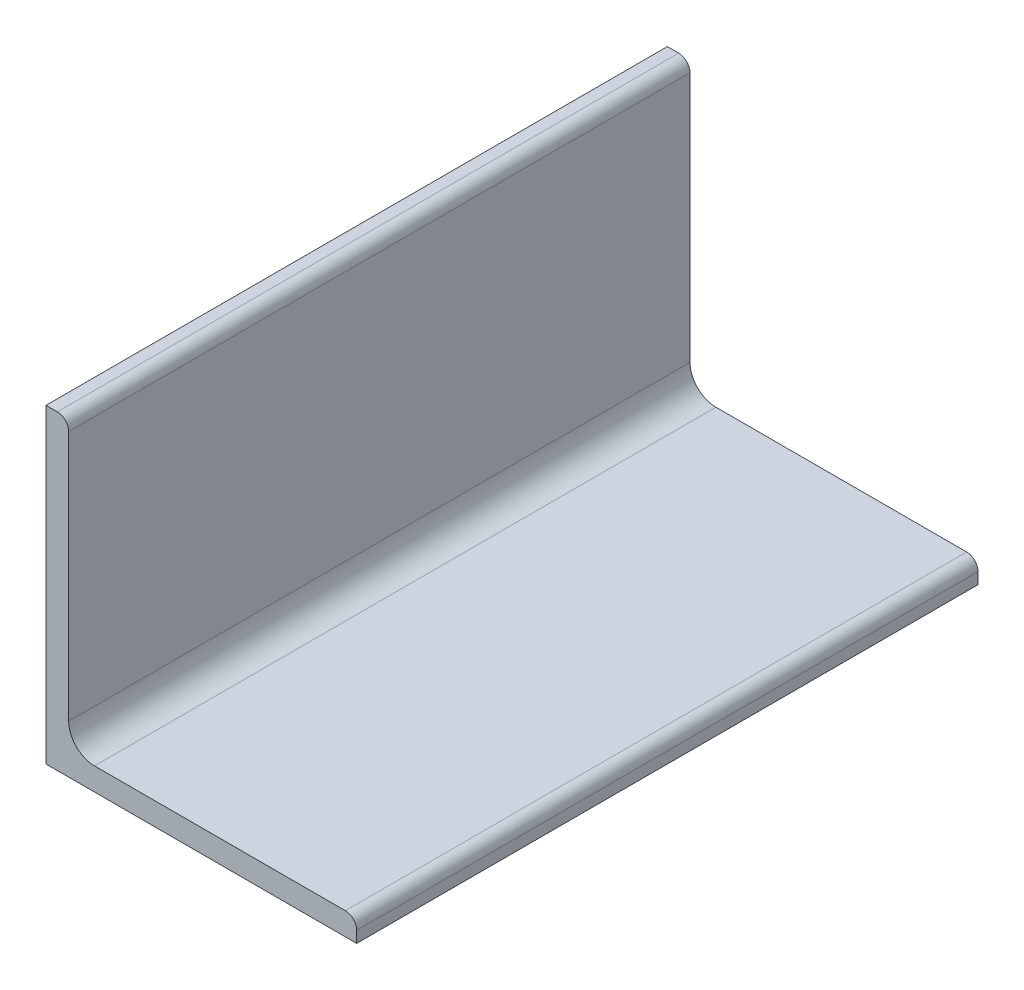
ISO-10303-21;
HEADER;
FILE_DESCRIPTION(('STEP AP214'),'2;1');
FILE_NAME('part.step','',(''),(''),'','','');
FILE_SCHEMA(('AUTOMOTIVE_DESIGN { 1 0 10303 214 1 1 1 1 }'));
ENDSEC;
DATA;
#1=APPLICATION_CONTEXT('core data for automotive mechanical design processes');
#2=APPLICATION_PROTOCOL_DEFINITION('international standard','automotive_design',2000,#1);
#3=PRODUCT_CONTEXT('',#1,'mechanical');
#4=PRODUCT('Part','Part','',(#3));
#5=PRODUCT_RELATED_PRODUCT_CATEGORY('part','',(#4));
#6=PRODUCT_DEFINITION_FORMATION('','',#4);
#7=PRODUCT_DEFINITION_CONTEXT('part definition',#1,'design');
#8=PRODUCT_DEFINITION('design','',#6,#7);
#9=PRODUCT_DEFINITION_SHAPE('','',#8);
#10=(LENGTH_UNIT() NAMED_UNIT(*) SI_UNIT(.MILLI.,.METRE.));
#11=(NAMED_UNIT(*) PLANE_ANGLE_UNIT() SI_UNIT($,.RADIAN.));
#12=(NAMED_UNIT(*) SI_UNIT($,.STERADIAN.) SOLID_ANGLE_UNIT());
#13=UNCERTAINTY_MEASURE_WITH_UNIT(LENGTH_MEASURE(1.E-05),#10,'distance_accuracy_value','');
#14=(GEOMETRIC_REPRESENTATION_CONTEXT(3) GLOBAL_UNCERTAINTY_ASSIGNED_CONTEXT((#13)) GLOBAL_UNIT_ASSIGNED_CONTEXT((#10,
#11,#12)) REPRESENTATION_CONTEXT('',''));
#15=CARTESIAN_POINT('',(0.,0.,0.));
#16=DIRECTION('',(0.,0.,1.));
#17=DIRECTION('',(1.,0.,0.));
#18=AXIS2_PLACEMENT_3D('',#15,#16,#17);
#19=CARTESIAN_POINT('',(0.425014111727251,152.925428131371,304.8));
#20=DIRECTION('',(1.,0.,0.));
#21=DIRECTION('',(0.,0.,-1.));
#22=AXIS2_PLACEMENT_3D('',#19,#20,#21);
#23=PLANE('',#22);
#24=DIRECTION('',(0.,-1.,0.));
#25=VECTOR('',#24,1.);
#26=CARTESIAN_POINT('',(0.425014111727251,152.925428131371,0.));
#27=LINE('',#26,#25);
#28=CARTESIAN_POINT('',(0.425014111727251,152.925428131371,0.));
#29=VERTEX_POINT('',#28);
#30=CARTESIAN_POINT('',(0.425014111727251,0.525428131371291,0.));
#31=VERTEX_POINT('',#30);
#32=EDGE_CURVE('E135',#29,#31,#27,.T.);
#33=ORIENTED_EDGE('',*,*,#32,.T.);
#34=DIRECTION('',(0.,0.,-1.));
#35=VECTOR('',#34,1.);
#36=CARTESIAN_POINT('',(0.425014111727251,0.525428131371291,304.8));
#37=LINE('',#36,#35);
#38=CARTESIAN_POINT('',(0.425014111727251,0.525428131371291,304.8));
#39=VERTEX_POINT('',#38);
#40=EDGE_CURVE('E11',#39,#31,#37,.T.);
#41=ORIENTED_EDGE('',*,*,#40,.F.);
#42=DIRECTION('',(0.,-1.,0.));
#43=VECTOR('',#42,1.);
#44=CARTESIAN_POINT('',(0.425014111727251,152.925428131371,304.8));
#45=LINE('',#44,#43);
#46=CARTESIAN_POINT('',(0.425014111727251,152.925428131371,304.8));
#47=VERTEX_POINT('',#46);
#48=EDGE_CURVE('E151',#47,#39,#45,.T.);
#49=ORIENTED_EDGE('',*,*,#48,.F.);
#50=DIRECTION('',(0.,0.,-1.));
#51=VECTOR('',#50,1.);
#52=CARTESIAN_POINT('',(0.425014111727251,152.925428131371,304.8));
#53=LINE('',#52,#51);
#54=EDGE_CURVE('E131',#47,#29,#53,.T.);
#55=ORIENTED_EDGE('',*,*,#54,.T.);
#56=EDGE_LOOP('',(#33,#41,#49,#55));
#57=FACE_BOUND('',#56,.T.);
#58=ADVANCED_FACE('F33',(#57),#23,.F.);
#59=CARTESIAN_POINT('',(0.425014111727251,0.525428131371291,304.8));
#60=DIRECTION('',(0.,1.,0.));
#61=DIRECTION('',(0.,0.,1.));
#62=AXIS2_PLACEMENT_3D('',#59,#60,#61);
#63=PLANE('',#62);
#64=DIRECTION('',(1.,0.,0.));
#65=VECTOR('',#64,1.);
#66=CARTESIAN_POINT('',(0.425014111727251,0.525428131371291,0.));
#67=LINE('',#66,#65);
#68=CARTESIAN_POINT('',(152.825014111727,0.525428131371291,0.));
#69=VERTEX_POINT('',#68);
#70=EDGE_CURVE('E138',#31,#69,#67,.T.);
#71=ORIENTED_EDGE('',*,*,#70,.T.);
#72=DIRECTION('',(0.,0.,-1.));
#73=VECTOR('',#72,1.);
#74=CARTESIAN_POINT('',(152.825014111727,0.525428131371291,304.8));
#75=LINE('',#74,#73);
#76=CARTESIAN_POINT('',(152.825014111727,0.525428131371291,304.8));
#77=VERTEX_POINT('',#76);
#78=EDGE_CURVE('E41',#77,#69,#75,.T.);
#79=ORIENTED_EDGE('',*,*,#78,.F.);
#80=DIRECTION('',(1.,0.,0.));
#81=VECTOR('',#80,1.);
#82=CARTESIAN_POINT('',(0.425014111727251,0.525428131371291,304.8));
#83=LINE('',#82,#81);
#84=EDGE_CURVE('E95',#39,#77,#83,.T.);
#85=ORIENTED_EDGE('',*,*,#84,.F.);
#86=ORIENTED_EDGE('',*,*,#40,.T.);
#87=EDGE_LOOP('',(#71,#79,#85,#86));
#88=FACE_BOUND('',#87,.T.);
#89=ADVANCED_FACE('F194',(#88),#63,.F.);
#90=CARTESIAN_POINT('',(152.825014111727,0.525428131371291,304.8));
#91=DIRECTION('',(-1.,0.,0.));
#92=DIRECTION('',(0.,0.,1.));
#93=AXIS2_PLACEMENT_3D('',#90,#91,#92);
#94=PLANE('',#93);
#95=DIRECTION('',(0.,1.,0.));
#96=VECTOR('',#95,1.);
#97=CARTESIAN_POINT('',(152.825014111727,0.525428131371291,0.));
#98=LINE('',#97,#96);
#99=CARTESIAN_POINT('',(152.825014111727,6.08167813137129,0.));
#100=VERTEX_POINT('',#99);
#101=EDGE_CURVE('E140',#69,#100,#98,.T.);
#102=ORIENTED_EDGE('',*,*,#101,.T.);
#103=DIRECTION('',(0.,0.,-1.));
#104=VECTOR('',#103,1.);
#105=CARTESIAN_POINT('',(152.825014111727,6.08167813137129,304.8));
#106=LINE('',#105,#104);
#107=CARTESIAN_POINT('',(152.825014111727,6.08167813137129,304.8));
#108=VERTEX_POINT('',#107);
#109=EDGE_CURVE('E161',#108,#100,#106,.T.);
#110=ORIENTED_EDGE('',*,*,#109,.F.);
#111=DIRECTION('',(0.,1.,0.));
#112=VECTOR('',#111,1.);
#113=CARTESIAN_POINT('',(152.825014111727,0.525428131371291,304.8));
#114=LINE('',#113,#112);
#115=EDGE_CURVE('E169',#77,#108,#114,.T.);
#116=ORIENTED_EDGE('',*,*,#115,.F.);
#117=ORIENTED_EDGE('',*,*,#78,.T.);
#118=EDGE_LOOP('',(#102,#110,#116,#117));
#119=FACE_BOUND('',#118,.T.);
#120=ADVANCED_FACE('F167',(#119),#94,.F.);
#121=CARTESIAN_POINT('',(147.268764111727,6.08167813137129,304.8));
#122=DIRECTION('',(0.,0.,-1.));
#123=DIRECTION('',(-1.,0.,0.));
#124=AXIS2_PLACEMENT_3D('',#121,#122,#123);
#125=CYLINDRICAL_SURFACE('',#124,5.55625000000001);
#126=CARTESIAN_POINT('',(147.268764111727,6.08167813137129,0.));
#127=DIRECTION('',(0.,0.,1.));
#128=DIRECTION('',(1.,0.,0.));
#129=AXIS2_PLACEMENT_3D('',#126,#127,#128);
#130=CIRCLE('',#129,5.55625000000001);
#131=CARTESIAN_POINT('',(147.268764111727,11.6379281313713,0.));
#132=VERTEX_POINT('',#131);
#133=EDGE_CURVE('E142',#100,#132,#130,.T.);
#134=ORIENTED_EDGE('',*,*,#133,.T.);
#135=DIRECTION('',(0.,0.,-1.));
#136=VECTOR('',#135,1.);
#137=CARTESIAN_POINT('',(147.268764111727,11.6379281313713,304.8));
#138=LINE('',#137,#136);
#139=CARTESIAN_POINT('',(147.268764111727,11.6379281313713,304.8));
#140=VERTEX_POINT('',#139);
#141=EDGE_CURVE('E158',#140,#132,#138,.T.);
#142=ORIENTED_EDGE('',*,*,#141,.F.);
#143=CARTESIAN_POINT('',(147.268764111727,6.08167813137129,304.8));
#144=DIRECTION('',(0.,0.,1.));
#145=DIRECTION('',(1.,0.,0.));
#146=AXIS2_PLACEMENT_3D('',#143,#144,#145);
#147=CIRCLE('',#146,5.55625000000001);
#148=EDGE_CURVE('E185',#108,#140,#147,.T.);
#149=ORIENTED_EDGE('',*,*,#148,.F.);
#150=ORIENTED_EDGE('',*,*,#109,.T.);
#151=EDGE_LOOP('',(#134,#142,#149,#150));
#152=FACE_BOUND('',#151,.T.);
#153=ADVANCED_FACE('F178',(#152),#125,.T.);
#154=CARTESIAN_POINT('',(147.268764111727,11.6379281313713,304.8));
#155=DIRECTION('',(0.,-1.,0.));
#156=DIRECTION('',(0.,0.,-1.));
#157=AXIS2_PLACEMENT_3D('',#154,#155,#156);
#158=PLANE('',#157);
#159=DIRECTION('',(-1.,0.,0.));
#160=VECTOR('',#159,1.);
#161=CARTESIAN_POINT('',(147.268764111727,11.6379281313713,0.));
#162=LINE('',#161,#160);
#163=CARTESIAN_POINT('',(24.2375141117273,11.6379281313713,0.));
#164=VERTEX_POINT('',#163);
#165=EDGE_CURVE('E144',#132,#164,#162,.T.);
#166=ORIENTED_EDGE('',*,*,#165,.T.);
#167=DIRECTION('',(0.,0.,-1.));
#168=VECTOR('',#167,1.);
#169=CARTESIAN_POINT('',(24.2375141117273,11.6379281313713,304.8));
#170=LINE('',#169,#168);
#171=CARTESIAN_POINT('',(24.2375141117273,11.6379281313713,304.8));
#172=VERTEX_POINT('',#171);
#173=EDGE_CURVE('E155',#172,#164,#170,.T.);
#174=ORIENTED_EDGE('',*,*,#173,.F.);
#175=DIRECTION('',(-1.,0.,0.));
#176=VECTOR('',#175,1.);
#177=CARTESIAN_POINT('',(147.268764111727,11.6379281313713,304.8));
#178=LINE('',#177,#176);
#179=EDGE_CURVE('E184',#140,#172,#178,.T.);
#180=ORIENTED_EDGE('',*,*,#179,.F.);
#181=ORIENTED_EDGE('',*,*,#141,.T.);
#182=EDGE_LOOP('',(#166,#174,#180,#181));
#183=FACE_BOUND('',#182,.T.);
#184=ADVANCED_FACE('F182',(#183),#158,.F.);
#185=CARTESIAN_POINT('',(24.2375141117272,24.3379281313713,304.8));
#186=DIRECTION('',(0.,0.,-1.));
#187=DIRECTION('',(-1.,0.,0.));
#188=AXIS2_PLACEMENT_3D('',#185,#186,#187);
#189=CYLINDRICAL_SURFACE('',#188,12.7);
#190=CARTESIAN_POINT('',(24.2375141117272,24.3379281313713,0.));
#191=DIRECTION('',(0.,0.,-1.));
#192=DIRECTION('',(1.,0.,0.));
#193=AXIS2_PLACEMENT_3D('',#190,#191,#192);
#194=CIRCLE('',#193,12.7);
#195=CARTESIAN_POINT('',(11.5375141117273,24.3379281313713,0.));
#196=VERTEX_POINT('',#195);
#197=EDGE_CURVE('E146',#164,#196,#194,.T.);
#198=ORIENTED_EDGE('',*,*,#197,.T.);
#199=DIRECTION('',(0.,0.,-1.));
#200=VECTOR('',#199,1.);
#201=CARTESIAN_POINT('',(11.5375141117273,24.3379281313713,304.8));
#202=LINE('',#201,#200);
#203=CARTESIAN_POINT('',(11.5375141117273,24.3379281313713,304.8));
#204=VERTEX_POINT('',#203);
#205=EDGE_CURVE('E126',#204,#196,#202,.T.);
#206=ORIENTED_EDGE('',*,*,#205,.F.);
#207=CARTESIAN_POINT('',(24.2375141117272,24.3379281313713,304.8));
#208=DIRECTION('',(0.,0.,-1.));
#209=DIRECTION('',(1.,0.,0.));
#210=AXIS2_PLACEMENT_3D('',#207,#208,#209);
#211=CIRCLE('',#210,12.7);
#212=EDGE_CURVE('E117',#172,#204,#211,.T.);
#213=ORIENTED_EDGE('',*,*,#212,.F.);
#214=ORIENTED_EDGE('',*,*,#173,.T.);
#215=EDGE_LOOP('',(#198,#206,#213,#214));
#216=FACE_BOUND('',#215,.T.);
#217=ADVANCED_FACE('F206',(#216),#189,.F.);
#218=CARTESIAN_POINT('',(11.5375141117273,24.3379281313713,304.8));
#219=DIRECTION('',(-1.,0.,0.));
#220=DIRECTION('',(0.,0.,1.));
#221=AXIS2_PLACEMENT_3D('',#218,#219,#220);
#222=PLANE('',#221);
#223=DIRECTION('',(0.,1.,0.));
#224=VECTOR('',#223,1.);
#225=CARTESIAN_POINT('',(11.5375141117273,24.3379281313713,0.));
#226=LINE('',#225,#224);
#227=CARTESIAN_POINT('',(11.5375141117273,147.369178131371,0.));
#228=VERTEX_POINT('',#227);
#229=EDGE_CURVE('E125',#196,#228,#226,.T.);
#230=ORIENTED_EDGE('',*,*,#229,.T.);
#231=DIRECTION('',(0.,0.,-1.));
#232=VECTOR('',#231,1.);
#233=CARTESIAN_POINT('',(11.5375141117273,147.369178131371,304.8));
#234=LINE('',#233,#232);
#235=CARTESIAN_POINT('',(11.5375141117273,147.369178131371,304.8));
#236=VERTEX_POINT('',#235);
#237=EDGE_CURVE('E122',#236,#228,#234,.T.);
#238=ORIENTED_EDGE('',*,*,#237,.F.);
#239=DIRECTION('',(0.,1.,0.));
#240=VECTOR('',#239,1.);
#241=CARTESIAN_POINT('',(11.5375141117273,24.3379281313713,304.8));
#242=LINE('',#241,#240);
#243=EDGE_CURVE('E111',#204,#236,#242,.T.);
#244=ORIENTED_EDGE('',*,*,#243,.F.);
#245=ORIENTED_EDGE('',*,*,#205,.T.);
#246=EDGE_LOOP('',(#230,#238,#244,#245));
#247=FACE_BOUND('',#246,.T.);
#248=ADVANCED_FACE('F123',(#247),#222,.F.);
#249=CARTESIAN_POINT('',(5.98126411172725,147.369178131371,304.8));
#250=DIRECTION('',(0.,0.,-1.));
#251=DIRECTION('',(-1.,0.,0.));
#252=AXIS2_PLACEMENT_3D('',#249,#250,#251);
#253=CYLINDRICAL_SURFACE('',#252,5.55624999999999);
#254=CARTESIAN_POINT('',(5.98126411172725,147.369178131371,0.));
#255=DIRECTION('',(0.,0.,1.));
#256=DIRECTION('',(1.,0.,0.));
#257=AXIS2_PLACEMENT_3D('',#254,#255,#256);
#258=CIRCLE('',#257,5.55624999999999);
#259=CARTESIAN_POINT('',(5.98126411172725,152.925428131371,0.));
#260=VERTEX_POINT('',#259);
#261=EDGE_CURVE('E81',#228,#260,#258,.T.);
#262=ORIENTED_EDGE('',*,*,#261,.T.);
#263=DIRECTION('',(0.,0.,-1.));
#264=VECTOR('',#263,1.);
#265=CARTESIAN_POINT('',(5.98126411172725,152.925428131371,304.8));
#266=LINE('',#265,#264);
#267=CARTESIAN_POINT('',(5.98126411172725,152.925428131371,304.8));
#268=VERTEX_POINT('',#267);
#269=EDGE_CURVE('E127',#268,#260,#266,.T.);
#270=ORIENTED_EDGE('',*,*,#269,.F.);
#271=CARTESIAN_POINT('',(5.98126411172725,147.369178131371,304.8));
#272=DIRECTION('',(0.,0.,1.));
#273=DIRECTION('',(1.,0.,0.));
#274=AXIS2_PLACEMENT_3D('',#271,#272,#273);
#275=CIRCLE('',#274,5.55624999999999);
#276=EDGE_CURVE('E115',#236,#268,#275,.T.);
#277=ORIENTED_EDGE('',*,*,#276,.F.);
#278=ORIENTED_EDGE('',*,*,#237,.T.);
#279=EDGE_LOOP('',(#262,#270,#277,#278));
#280=FACE_BOUND('',#279,.T.);
#281=ADVANCED_FACE('F129',(#280),#253,.T.);
#282=CARTESIAN_POINT('',(5.98126411172725,152.925428131371,304.8));
#283=DIRECTION('',(0.,-1.,0.));
#284=DIRECTION('',(0.,0.,-1.));
#285=AXIS2_PLACEMENT_3D('',#282,#283,#284);
#286=PLANE('',#285);
#287=DIRECTION('',(-1.,0.,0.));
#288=VECTOR('',#287,1.);
#289=CARTESIAN_POINT('',(5.98126411172725,152.925428131371,0.));
#290=LINE('',#289,#288);
#291=EDGE_CURVE('E87',#260,#29,#290,.T.);
#292=ORIENTED_EDGE('',*,*,#291,.T.);
#293=ORIENTED_EDGE('',*,*,#54,.F.);
#294=DIRECTION('',(-1.,0.,0.));
#295=VECTOR('',#294,1.);
#296=CARTESIAN_POINT('',(5.98126411172725,152.925428131371,304.8));
#297=LINE('',#296,#295);
#298=EDGE_CURVE('E49',#268,#47,#297,.T.);
#299=ORIENTED_EDGE('',*,*,#298,.F.);
#300=ORIENTED_EDGE('',*,*,#269,.T.);
#301=EDGE_LOOP('',(#292,#293,#299,#300));
#302=FACE_BOUND('',#301,.T.);
#303=ADVANCED_FACE('F214',(#302),#286,.F.);
#304=CARTESIAN_POINT('',(147.268764111727,6.08167813137129,304.8));
#305=DIRECTION('',(0.,0.,1.));
#306=DIRECTION('',(1.,0.,0.));
#307=AXIS2_PLACEMENT_3D('',#304,#305,#306);
#308=PLANE('',#307);
#309=ORIENTED_EDGE('',*,*,#48,.T.);
#310=ORIENTED_EDGE('',*,*,#84,.T.);
#311=ORIENTED_EDGE('',*,*,#115,.T.);
#312=ORIENTED_EDGE('',*,*,#148,.T.);
#313=ORIENTED_EDGE('',*,*,#179,.T.);
#314=ORIENTED_EDGE('',*,*,#212,.T.);
#315=ORIENTED_EDGE('',*,*,#243,.T.);
#316=ORIENTED_EDGE('',*,*,#276,.T.);
#317=ORIENTED_EDGE('',*,*,#298,.T.);
#318=EDGE_LOOP('',(#309,#310,#311,#312,#313,#314,#315,#316,#317));
#319=FACE_BOUND('',#318,.T.);
#320=ADVANCED_FACE('F113',(#319),#308,.T.);
#321=CARTESIAN_POINT('',(147.268764111727,6.08167813137129,0.));
#322=DIRECTION('',(0.,0.,1.));
#323=DIRECTION('',(1.,0.,0.));
#324=AXIS2_PLACEMENT_3D('',#321,#322,#323);
#325=PLANE('',#324);
#326=ORIENTED_EDGE('',*,*,#32,.F.);
#327=ORIENTED_EDGE('',*,*,#291,.F.);
#328=ORIENTED_EDGE('',*,*,#261,.F.);
#329=ORIENTED_EDGE('',*,*,#229,.F.);
#330=ORIENTED_EDGE('',*,*,#197,.F.);
#331=ORIENTED_EDGE('',*,*,#165,.F.);
#332=ORIENTED_EDGE('',*,*,#133,.F.);
#333=ORIENTED_EDGE('',*,*,#101,.F.);
#334=ORIENTED_EDGE('',*,*,#70,.F.);
#335=EDGE_LOOP('',(#326,#327,#328,#329,#330,#331,#332,#333,#334));
#336=FACE_BOUND('',#335,.T.);
#337=ADVANCED_FACE('F173',(#336),#325,.F.);
#338=CLOSED_SHELL('',(#58,#89,#120,#153,#184,#217,#248,#281,#303,#320,#337));
#339=MANIFOLD_SOLID_BREP('B2',#338);
#340=ADVANCED_BREP_SHAPE_REPRESENTATION('',(#18,#339),#14);
#341=SHAPE_DEFINITION_REPRESENTATION(#9,#340);
ENDSEC;
END-ISO-10303-21;
